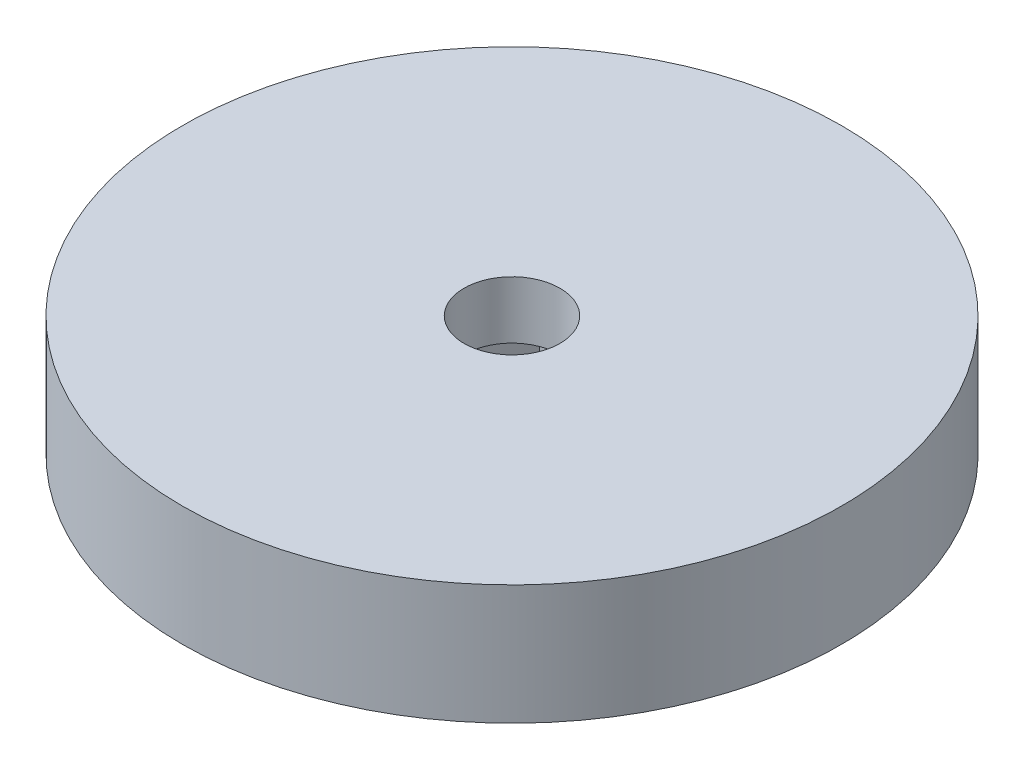
ISO-10303-21;
HEADER;
FILE_DESCRIPTION(('STEP AP214'),'2;1');
FILE_NAME('part.step','',(''),(''),'','','');
FILE_SCHEMA(('AUTOMOTIVE_DESIGN { 1 0 10303 214 1 1 1 1 }'));
ENDSEC;
DATA;
#1=APPLICATION_CONTEXT('core data for automotive mechanical design processes');
#2=APPLICATION_PROTOCOL_DEFINITION('international standard','automotive_design',2000,#1);
#3=PRODUCT_CONTEXT('',#1,'mechanical');
#4=PRODUCT('Part','Part','',(#3));
#5=PRODUCT_RELATED_PRODUCT_CATEGORY('part','',(#4));
#6=PRODUCT_DEFINITION_FORMATION('','',#4);
#7=PRODUCT_DEFINITION_CONTEXT('part definition',#1,'design');
#8=PRODUCT_DEFINITION('design','',#6,#7);
#9=PRODUCT_DEFINITION_SHAPE('','',#8);
#10=(LENGTH_UNIT() NAMED_UNIT(*) SI_UNIT(.MILLI.,.METRE.));
#11=(NAMED_UNIT(*) PLANE_ANGLE_UNIT() SI_UNIT($,.RADIAN.));
#12=(NAMED_UNIT(*) SI_UNIT($,.STERADIAN.) SOLID_ANGLE_UNIT());
#13=UNCERTAINTY_MEASURE_WITH_UNIT(LENGTH_MEASURE(1.E-05),#10,'distance_accuracy_value','');
#14=(GEOMETRIC_REPRESENTATION_CONTEXT(3) GLOBAL_UNCERTAINTY_ASSIGNED_CONTEXT((#13)) GLOBAL_UNIT_ASSIGNED_CONTEXT((#10,
#11,#12)) REPRESENTATION_CONTEXT('',''));
#15=CARTESIAN_POINT('',(0.,0.,0.));
#16=DIRECTION('',(0.,0.,1.));
#17=DIRECTION('',(1.,0.,0.));
#18=AXIS2_PLACEMENT_3D('',#15,#16,#17);
#19=CARTESIAN_POINT('',(0.,0.,0.));
#20=DIRECTION('',(0.,-1.,0.));
#21=DIRECTION('',(0.,0.,-1.));
#22=AXIS2_PLACEMENT_3D('',#19,#20,#21);
#23=CYLINDRICAL_SURFACE('',#22,4.99999999999999);
#24=CARTESIAN_POINT('',(0.,12.5,0.));
#25=DIRECTION('',(0.,-1.,0.));
#26=DIRECTION('',(0.,0.,-1.));
#27=AXIS2_PLACEMENT_3D('',#24,#25,#26);
#28=CIRCLE('',#27,5.);
#29=CARTESIAN_POINT('',(0.,12.5,-5.));
#30=VERTEX_POINT('',#29);
#31=EDGE_CURVE('E166',#30,#30,#28,.T.);
#32=ORIENTED_EDGE('',*,*,#31,.F.);
#33=EDGE_LOOP('',(#32));
#34=FACE_BOUND('',#33,.T.);
#35=CARTESIAN_POINT('',(0.,6.5,0.));
#36=DIRECTION('',(0.,-1.,0.));
#37=DIRECTION('',(0.,0.,-1.));
#38=AXIS2_PLACEMENT_3D('',#35,#36,#37);
#39=CIRCLE('',#38,4.99999999999999);
#40=CARTESIAN_POINT('',(0.,6.5,-4.99999999999999));
#41=VERTEX_POINT('',#40);
#42=EDGE_CURVE('E43',#41,#41,#39,.F.);
#43=ORIENTED_EDGE('',*,*,#42,.F.);
#44=EDGE_LOOP('',(#43));
#45=FACE_BOUND('',#44,.T.);
#46=ADVANCED_FACE('F39',(#34,#45),#23,.F.);
#47=CARTESIAN_POINT('',(0.,12.5,0.));
#48=DIRECTION('',(0.,-1.,0.));
#49=DIRECTION('',(0.,0.,-1.));
#50=AXIS2_PLACEMENT_3D('',#47,#48,#49);
#51=CYLINDRICAL_SURFACE('',#50,34.384);
#52=CARTESIAN_POINT('',(0.,12.5,0.));
#53=DIRECTION('',(0.,1.,0.));
#54=DIRECTION('',(0.,0.,1.));
#55=AXIS2_PLACEMENT_3D('',#52,#53,#54);
#56=CIRCLE('',#55,34.384);
#57=CARTESIAN_POINT('',(0.,12.5,34.384));
#58=VERTEX_POINT('',#57);
#59=EDGE_CURVE('E11',#58,#58,#56,.T.);
#60=ORIENTED_EDGE('',*,*,#59,.F.);
#61=EDGE_LOOP('',(#60));
#62=FACE_BOUND('',#61,.T.);
#63=CARTESIAN_POINT('',(0.,0.,0.));
#64=DIRECTION('',(0.,1.,0.));
#65=DIRECTION('',(0.,0.,1.));
#66=AXIS2_PLACEMENT_3D('',#63,#64,#65);
#67=CIRCLE('',#66,34.384);
#68=CARTESIAN_POINT('',(0.,0.,34.384));
#69=VERTEX_POINT('',#68);
#70=EDGE_CURVE('E49',#69,#69,#67,.T.);
#71=ORIENTED_EDGE('',*,*,#70,.T.);
#72=EDGE_LOOP('',(#71));
#73=FACE_BOUND('',#72,.T.);
#74=ADVANCED_FACE('F41',(#62,#73),#51,.T.);
#75=CARTESIAN_POINT('',(0.,12.5,0.));
#76=DIRECTION('',(0.,1.,0.));
#77=DIRECTION('',(0.,0.,1.));
#78=AXIS2_PLACEMENT_3D('',#75,#76,#77);
#79=PLANE('',#78);
#80=ORIENTED_EDGE('',*,*,#31,.T.);
#81=EDGE_LOOP('',(#80));
#82=FACE_BOUND('',#81,.T.);
#83=ORIENTED_EDGE('',*,*,#59,.T.);
#84=EDGE_LOOP('',(#83));
#85=FACE_BOUND('',#84,.T.);
#86=ADVANCED_FACE('F176',(#82,#85),#79,.T.);
#87=CARTESIAN_POINT('',(0.,0.,0.));
#88=DIRECTION('',(0.,1.,0.));
#89=DIRECTION('',(0.,0.,1.));
#90=AXIS2_PLACEMENT_3D('',#87,#88,#89);
#91=PLANE('',#90);
#92=DIRECTION('',(-1.,0.,0.));
#93=VECTOR('',#92,1.);
#94=CARTESIAN_POINT('',(3.89711431702997,0.,6.75));
#95=LINE('',#94,#93);
#96=CARTESIAN_POINT('',(3.89711431702997,0.,6.75));
#97=VERTEX_POINT('',#96);
#98=CARTESIAN_POINT('',(-3.89711431702998,0.,6.75));
#99=VERTEX_POINT('',#98);
#100=EDGE_CURVE('E138',#97,#99,#95,.T.);
#101=ORIENTED_EDGE('',*,*,#100,.F.);
#102=DIRECTION('',(-0.5,0.,0.866025403784439));
#103=VECTOR('',#102,1.);
#104=CARTESIAN_POINT('',(7.79422863405995,0.,0.));
#105=LINE('',#104,#103);
#106=CARTESIAN_POINT('',(7.79422863405995,0.,0.));
#107=VERTEX_POINT('',#106);
#108=EDGE_CURVE('E57',#107,#97,#105,.T.);
#109=ORIENTED_EDGE('',*,*,#108,.F.);
#110=DIRECTION('',(0.5,0.,0.866025403784439));
#111=VECTOR('',#110,1.);
#112=CARTESIAN_POINT('',(3.89711431702997,0.,-6.75));
#113=LINE('',#112,#111);
#114=CARTESIAN_POINT('',(3.89711431702997,0.,-6.75));
#115=VERTEX_POINT('',#114);
#116=EDGE_CURVE('E151',#115,#107,#113,.T.);
#117=ORIENTED_EDGE('',*,*,#116,.F.);
#118=DIRECTION('',(1.,0.,0.));
#119=VECTOR('',#118,1.);
#120=CARTESIAN_POINT('',(-3.89711431702997,0.,-6.75));
#121=LINE('',#120,#119);
#122=CARTESIAN_POINT('',(-3.89711431702997,0.,-6.75));
#123=VERTEX_POINT('',#122);
#124=EDGE_CURVE('E148',#123,#115,#121,.T.);
#125=ORIENTED_EDGE('',*,*,#124,.F.);
#126=DIRECTION('',(0.5,0.,-0.866025403784439));
#127=VECTOR('',#126,1.);
#128=CARTESIAN_POINT('',(-7.79422863405995,0.,0.));
#129=LINE('',#128,#127);
#130=CARTESIAN_POINT('',(-7.79422863405995,0.,0.));
#131=VERTEX_POINT('',#130);
#132=EDGE_CURVE('E105',#131,#123,#129,.T.);
#133=ORIENTED_EDGE('',*,*,#132,.F.);
#134=DIRECTION('',(-0.5,0.,-0.866025403784439));
#135=VECTOR('',#134,1.);
#136=CARTESIAN_POINT('',(-3.89711431702998,0.,6.75));
#137=LINE('',#136,#135);
#138=EDGE_CURVE('E142',#99,#131,#137,.T.);
#139=ORIENTED_EDGE('',*,*,#138,.F.);
#140=EDGE_LOOP('',(#101,#109,#117,#125,#133,#139));
#141=FACE_BOUND('',#140,.T.);
#142=ORIENTED_EDGE('',*,*,#70,.F.);
#143=EDGE_LOOP('',(#142));
#144=FACE_BOUND('',#143,.T.);
#145=ADVANCED_FACE('F174',(#141,#144),#91,.F.);
#146=CARTESIAN_POINT('',(0.,6.5,0.));
#147=DIRECTION('',(0.,-1.,0.));
#148=DIRECTION('',(0.,0.,-1.));
#149=AXIS2_PLACEMENT_3D('',#146,#147,#148);
#150=PLANE('',#149);
#151=DIRECTION('',(-0.5,0.,0.866025403784439));
#152=VECTOR('',#151,1.);
#153=CARTESIAN_POINT('',(7.79422863405995,6.5,0.));
#154=LINE('',#153,#152);
#155=CARTESIAN_POINT('',(7.79422863405995,6.5,0.));
#156=VERTEX_POINT('',#155);
#157=CARTESIAN_POINT('',(3.89711431702997,6.5,6.75));
#158=VERTEX_POINT('',#157);
#159=EDGE_CURVE('E154',#156,#158,#154,.T.);
#160=ORIENTED_EDGE('',*,*,#159,.T.);
#161=DIRECTION('',(-1.,0.,0.));
#162=VECTOR('',#161,1.);
#163=CARTESIAN_POINT('',(3.89711431702997,6.5,6.75));
#164=LINE('',#163,#162);
#165=CARTESIAN_POINT('',(-3.89711431702998,6.5,6.75));
#166=VERTEX_POINT('',#165);
#167=EDGE_CURVE('E130',#158,#166,#164,.T.);
#168=ORIENTED_EDGE('',*,*,#167,.T.);
#169=DIRECTION('',(-0.5,0.,-0.866025403784439));
#170=VECTOR('',#169,1.);
#171=CARTESIAN_POINT('',(-3.89711431702998,6.5,6.75));
#172=LINE('',#171,#170);
#173=CARTESIAN_POINT('',(-7.79422863405995,6.5,0.));
#174=VERTEX_POINT('',#173);
#175=EDGE_CURVE('E126',#166,#174,#172,.T.);
#176=ORIENTED_EDGE('',*,*,#175,.T.);
#177=DIRECTION('',(0.5,0.,-0.866025403784439));
#178=VECTOR('',#177,1.);
#179=CARTESIAN_POINT('',(-7.79422863405995,6.5,0.));
#180=LINE('',#179,#178);
#181=CARTESIAN_POINT('',(-3.89711431702997,6.5,-6.75));
#182=VERTEX_POINT('',#181);
#183=EDGE_CURVE('E102',#174,#182,#180,.T.);
#184=ORIENTED_EDGE('',*,*,#183,.T.);
#185=DIRECTION('',(1.,0.,0.));
#186=VECTOR('',#185,1.);
#187=CARTESIAN_POINT('',(-3.89711431702997,6.5,-6.75));
#188=LINE('',#187,#186);
#189=CARTESIAN_POINT('',(3.89711431702997,6.5,-6.75));
#190=VERTEX_POINT('',#189);
#191=EDGE_CURVE('E114',#182,#190,#188,.T.);
#192=ORIENTED_EDGE('',*,*,#191,.T.);
#193=DIRECTION('',(0.5,0.,0.866025403784439));
#194=VECTOR('',#193,1.);
#195=CARTESIAN_POINT('',(3.89711431702997,6.5,-6.75));
#196=LINE('',#195,#194);
#197=EDGE_CURVE('E119',#190,#156,#196,.T.);
#198=ORIENTED_EDGE('',*,*,#197,.T.);
#199=EDGE_LOOP('',(#160,#168,#176,#184,#192,#198));
#200=FACE_BOUND('',#199,.T.);
#201=ORIENTED_EDGE('',*,*,#42,.T.);
#202=EDGE_LOOP('',(#201));
#203=FACE_BOUND('',#202,.T.);
#204=ADVANCED_FACE('F122',(#200,#203),#150,.T.);
#205=CARTESIAN_POINT('',(7.79422863405995,6.5,0.));
#206=DIRECTION('',(0.866025403784439,0.,0.5));
#207=DIRECTION('',(0.5,0.,-0.866025403784439));
#208=AXIS2_PLACEMENT_3D('',#205,#206,#207);
#209=PLANE('',#208);
#210=ORIENTED_EDGE('',*,*,#108,.T.);
#211=DIRECTION('',(0.,-1.,0.));
#212=VECTOR('',#211,1.);
#213=CARTESIAN_POINT('',(3.89711431702997,6.5,6.75));
#214=LINE('',#213,#212);
#215=EDGE_CURVE('E87',#158,#97,#214,.T.);
#216=ORIENTED_EDGE('',*,*,#215,.F.);
#217=ORIENTED_EDGE('',*,*,#159,.F.);
#218=DIRECTION('',(0.,-1.,0.));
#219=VECTOR('',#218,1.);
#220=CARTESIAN_POINT('',(7.79422863405995,6.5,0.));
#221=LINE('',#220,#219);
#222=EDGE_CURVE('E65',#156,#107,#221,.T.);
#223=ORIENTED_EDGE('',*,*,#222,.T.);
#224=EDGE_LOOP('',(#210,#216,#217,#223));
#225=FACE_BOUND('',#224,.T.);
#226=ADVANCED_FACE('F182',(#225),#209,.F.);
#227=CARTESIAN_POINT('',(3.89711431702997,6.5,-6.75));
#228=DIRECTION('',(0.866025403784439,0.,-0.5));
#229=DIRECTION('',(-0.5,0.,-0.866025403784439));
#230=AXIS2_PLACEMENT_3D('',#227,#228,#229);
#231=PLANE('',#230);
#232=ORIENTED_EDGE('',*,*,#116,.T.);
#233=ORIENTED_EDGE('',*,*,#222,.F.);
#234=ORIENTED_EDGE('',*,*,#197,.F.);
#235=DIRECTION('',(0.,-1.,0.));
#236=VECTOR('',#235,1.);
#237=CARTESIAN_POINT('',(3.89711431702997,6.5,-6.75));
#238=LINE('',#237,#236);
#239=EDGE_CURVE('E110',#190,#115,#238,.T.);
#240=ORIENTED_EDGE('',*,*,#239,.T.);
#241=EDGE_LOOP('',(#232,#233,#234,#240));
#242=FACE_BOUND('',#241,.T.);
#243=ADVANCED_FACE('F199',(#242),#231,.F.);
#244=CARTESIAN_POINT('',(-3.89711431702997,6.5,-6.75));
#245=DIRECTION('',(0.,0.,-1.));
#246=DIRECTION('',(-1.,0.,0.));
#247=AXIS2_PLACEMENT_3D('',#244,#245,#246);
#248=PLANE('',#247);
#249=ORIENTED_EDGE('',*,*,#124,.T.);
#250=ORIENTED_EDGE('',*,*,#239,.F.);
#251=ORIENTED_EDGE('',*,*,#191,.F.);
#252=DIRECTION('',(0.,-1.,0.));
#253=VECTOR('',#252,1.);
#254=CARTESIAN_POINT('',(-3.89711431702997,6.5,-6.75));
#255=LINE('',#254,#253);
#256=EDGE_CURVE('E98',#182,#123,#255,.T.);
#257=ORIENTED_EDGE('',*,*,#256,.T.);
#258=EDGE_LOOP('',(#249,#250,#251,#257));
#259=FACE_BOUND('',#258,.T.);
#260=ADVANCED_FACE('F115',(#259),#248,.F.);
#261=CARTESIAN_POINT('',(-7.79422863405995,6.5,0.));
#262=DIRECTION('',(-0.866025403784439,0.,-0.5));
#263=DIRECTION('',(-0.5,0.,0.866025403784439));
#264=AXIS2_PLACEMENT_3D('',#261,#262,#263);
#265=PLANE('',#264);
#266=ORIENTED_EDGE('',*,*,#132,.T.);
#267=ORIENTED_EDGE('',*,*,#256,.F.);
#268=ORIENTED_EDGE('',*,*,#183,.F.);
#269=DIRECTION('',(0.,-1.,0.));
#270=VECTOR('',#269,1.);
#271=CARTESIAN_POINT('',(-7.79422863405995,6.5,0.));
#272=LINE('',#271,#270);
#273=EDGE_CURVE('E111',#174,#131,#272,.T.);
#274=ORIENTED_EDGE('',*,*,#273,.T.);
#275=EDGE_LOOP('',(#266,#267,#268,#274));
#276=FACE_BOUND('',#275,.T.);
#277=ADVANCED_FACE('F100',(#276),#265,.F.);
#278=CARTESIAN_POINT('',(-3.89711431702998,6.5,6.75));
#279=DIRECTION('',(-0.866025403784439,0.,0.5));
#280=DIRECTION('',(0.5,0.,0.866025403784439));
#281=AXIS2_PLACEMENT_3D('',#278,#279,#280);
#282=PLANE('',#281);
#283=ORIENTED_EDGE('',*,*,#138,.T.);
#284=ORIENTED_EDGE('',*,*,#273,.F.);
#285=ORIENTED_EDGE('',*,*,#175,.F.);
#286=DIRECTION('',(0.,-1.,0.));
#287=VECTOR('',#286,1.);
#288=CARTESIAN_POINT('',(-3.89711431702998,6.5,6.75));
#289=LINE('',#288,#287);
#290=EDGE_CURVE('E161',#166,#99,#289,.T.);
#291=ORIENTED_EDGE('',*,*,#290,.T.);
#292=EDGE_LOOP('',(#283,#284,#285,#291));
#293=FACE_BOUND('',#292,.T.);
#294=ADVANCED_FACE('F203',(#293),#282,.F.);
#295=CARTESIAN_POINT('',(3.89711431702997,6.5,6.75));
#296=DIRECTION('',(0.,0.,1.));
#297=DIRECTION('',(1.,0.,0.));
#298=AXIS2_PLACEMENT_3D('',#295,#296,#297);
#299=PLANE('',#298);
#300=ORIENTED_EDGE('',*,*,#100,.T.);
#301=ORIENTED_EDGE('',*,*,#290,.F.);
#302=ORIENTED_EDGE('',*,*,#167,.F.);
#303=ORIENTED_EDGE('',*,*,#215,.T.);
#304=EDGE_LOOP('',(#300,#301,#302,#303));
#305=FACE_BOUND('',#304,.T.);
#306=ADVANCED_FACE('F200',(#305),#299,.F.);
#307=CLOSED_SHELL('',(#46,#74,#86,#145,#204,#226,#243,#260,#277,#294,#306));
#308=MANIFOLD_SOLID_BREP('B2',#307);
#309=ADVANCED_BREP_SHAPE_REPRESENTATION('',(#18,#308),#14);
#310=SHAPE_DEFINITION_REPRESENTATION(#9,#309);
ENDSEC;
END-ISO-10303-21;
